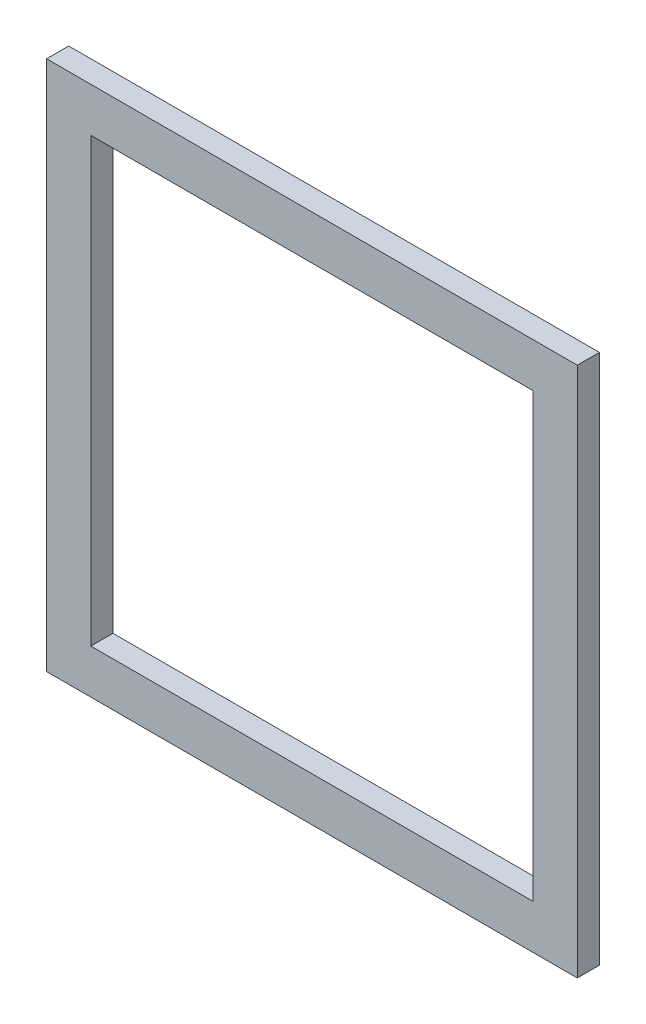
ISO-10303-21;
HEADER;
FILE_DESCRIPTION(('STEP AP214'),'2;1');
FILE_NAME('part.step','',(''),(''),'','','');
FILE_SCHEMA(('AUTOMOTIVE_DESIGN { 1 0 10303 214 1 1 1 1 }'));
ENDSEC;
DATA;
#1=APPLICATION_CONTEXT('core data for automotive mechanical design processes');
#2=APPLICATION_PROTOCOL_DEFINITION('international standard','automotive_design',2000,#1);
#3=PRODUCT_CONTEXT('',#1,'mechanical');
#4=PRODUCT('Part','Part','',(#3));
#5=PRODUCT_RELATED_PRODUCT_CATEGORY('part','',(#4));
#6=PRODUCT_DEFINITION_FORMATION('','',#4);
#7=PRODUCT_DEFINITION_CONTEXT('part definition',#1,'design');
#8=PRODUCT_DEFINITION('design','',#6,#7);
#9=PRODUCT_DEFINITION_SHAPE('','',#8);
#10=(LENGTH_UNIT() NAMED_UNIT(*) SI_UNIT(.MILLI.,.METRE.));
#11=(NAMED_UNIT(*) PLANE_ANGLE_UNIT() SI_UNIT($,.RADIAN.));
#12=(NAMED_UNIT(*) SI_UNIT($,.STERADIAN.) SOLID_ANGLE_UNIT());
#13=UNCERTAINTY_MEASURE_WITH_UNIT(LENGTH_MEASURE(1.E-05),#10,'distance_accuracy_value','');
#14=(GEOMETRIC_REPRESENTATION_CONTEXT(3) GLOBAL_UNCERTAINTY_ASSIGNED_CONTEXT((#13)) GLOBAL_UNIT_ASSIGNED_CONTEXT((#10,
#11,#12)) REPRESENTATION_CONTEXT('',''));
#15=CARTESIAN_POINT('',(0.,0.,0.));
#16=DIRECTION('',(0.,0.,1.));
#17=DIRECTION('',(1.,0.,0.));
#18=AXIS2_PLACEMENT_3D('',#15,#16,#17);
#19=CARTESIAN_POINT('',(0.,0.,3.175));
#20=DIRECTION('',(1.,0.,0.));
#21=DIRECTION('',(0.,0.,-1.));
#22=AXIS2_PLACEMENT_3D('',#19,#20,#21);
#23=PLANE('',#22);
#24=DIRECTION('',(0.,-1.,0.));
#25=VECTOR('',#24,1.);
#26=CARTESIAN_POINT('',(0.,0.,0.));
#27=LINE('',#26,#25);
#28=CARTESIAN_POINT('',(0.,76.2,0.));
#29=VERTEX_POINT('',#28);
#30=CARTESIAN_POINT('',(0.,0.,0.));
#31=VERTEX_POINT('',#30);
#32=EDGE_CURVE('E130',#29,#31,#27,.T.);
#33=ORIENTED_EDGE('',*,*,#32,.T.);
#34=DIRECTION('',(0.,0.,-1.));
#35=VECTOR('',#34,1.);
#36=CARTESIAN_POINT('',(0.,0.,3.175));
#37=LINE('',#36,#35);
#38=CARTESIAN_POINT('',(0.,0.,3.175));
#39=VERTEX_POINT('',#38);
#40=EDGE_CURVE('E11',#39,#31,#37,.T.);
#41=ORIENTED_EDGE('',*,*,#40,.F.);
#42=DIRECTION('',(0.,-1.,0.));
#43=VECTOR('',#42,1.);
#44=CARTESIAN_POINT('',(0.,0.,3.175));
#45=LINE('',#44,#43);
#46=CARTESIAN_POINT('',(0.,76.2,3.175));
#47=VERTEX_POINT('',#46);
#48=EDGE_CURVE('E134',#47,#39,#45,.T.);
#49=ORIENTED_EDGE('',*,*,#48,.F.);
#50=DIRECTION('',(0.,0.,-1.));
#51=VECTOR('',#50,1.);
#52=CARTESIAN_POINT('',(0.,76.2,3.175));
#53=LINE('',#52,#51);
#54=EDGE_CURVE('E144',#47,#29,#53,.T.);
#55=ORIENTED_EDGE('',*,*,#54,.T.);
#56=EDGE_LOOP('',(#33,#41,#49,#55));
#57=FACE_BOUND('',#56,.T.);
#58=ADVANCED_FACE('F33',(#57),#23,.F.);
#59=CARTESIAN_POINT('',(0.,0.,3.175));
#60=DIRECTION('',(0.,1.,0.));
#61=DIRECTION('',(0.,0.,1.));
#62=AXIS2_PLACEMENT_3D('',#59,#60,#61);
#63=PLANE('',#62);
#64=DIRECTION('',(1.,0.,0.));
#65=VECTOR('',#64,1.);
#66=CARTESIAN_POINT('',(0.,0.,0.));
#67=LINE('',#66,#65);
#68=CARTESIAN_POINT('',(76.2,0.,0.));
#69=VERTEX_POINT('',#68);
#70=EDGE_CURVE('E147',#31,#69,#67,.T.);
#71=ORIENTED_EDGE('',*,*,#70,.T.);
#72=DIRECTION('',(0.,0.,-1.));
#73=VECTOR('',#72,1.);
#74=CARTESIAN_POINT('',(76.2,0.,3.175));
#75=LINE('',#74,#73);
#76=CARTESIAN_POINT('',(76.2,0.,3.175));
#77=VERTEX_POINT('',#76);
#78=EDGE_CURVE('E40',#77,#69,#75,.T.);
#79=ORIENTED_EDGE('',*,*,#78,.F.);
#80=DIRECTION('',(1.,0.,0.));
#81=VECTOR('',#80,1.);
#82=CARTESIAN_POINT('',(0.,0.,3.175));
#83=LINE('',#82,#81);
#84=EDGE_CURVE('E137',#39,#77,#83,.T.);
#85=ORIENTED_EDGE('',*,*,#84,.F.);
#86=ORIENTED_EDGE('',*,*,#40,.T.);
#87=EDGE_LOOP('',(#71,#79,#85,#86));
#88=FACE_BOUND('',#87,.T.);
#89=ADVANCED_FACE('F175',(#88),#63,.F.);
#90=CARTESIAN_POINT('',(76.2,0.,3.175));
#91=DIRECTION('',(-1.,0.,0.));
#92=DIRECTION('',(0.,0.,1.));
#93=AXIS2_PLACEMENT_3D('',#90,#91,#92);
#94=PLANE('',#93);
#95=DIRECTION('',(0.,1.,0.));
#96=VECTOR('',#95,1.);
#97=CARTESIAN_POINT('',(76.2,0.,0.));
#98=LINE('',#97,#96);
#99=CARTESIAN_POINT('',(76.2,76.2,0.));
#100=VERTEX_POINT('',#99);
#101=EDGE_CURVE('E149',#69,#100,#98,.T.);
#102=ORIENTED_EDGE('',*,*,#101,.T.);
#103=DIRECTION('',(0.,0.,-1.));
#104=VECTOR('',#103,1.);
#105=CARTESIAN_POINT('',(76.2,76.2,3.175));
#106=LINE('',#105,#104);
#107=CARTESIAN_POINT('',(76.2,76.2,3.175));
#108=VERTEX_POINT('',#107);
#109=EDGE_CURVE('E154',#108,#100,#106,.T.);
#110=ORIENTED_EDGE('',*,*,#109,.F.);
#111=DIRECTION('',(0.,1.,0.));
#112=VECTOR('',#111,1.);
#113=CARTESIAN_POINT('',(76.2,0.,3.175));
#114=LINE('',#113,#112);
#115=EDGE_CURVE('E140',#77,#108,#114,.T.);
#116=ORIENTED_EDGE('',*,*,#115,.F.);
#117=ORIENTED_EDGE('',*,*,#78,.T.);
#118=EDGE_LOOP('',(#102,#110,#116,#117));
#119=FACE_BOUND('',#118,.T.);
#120=ADVANCED_FACE('F161',(#119),#94,.F.);
#121=CARTESIAN_POINT('',(0.,76.2,3.175));
#122=DIRECTION('',(0.,-1.,0.));
#123=DIRECTION('',(0.,0.,-1.));
#124=AXIS2_PLACEMENT_3D('',#121,#122,#123);
#125=PLANE('',#124);
#126=DIRECTION('',(-1.,0.,0.));
#127=VECTOR('',#126,1.);
#128=CARTESIAN_POINT('',(0.,76.2,0.));
#129=LINE('',#128,#127);
#130=EDGE_CURVE('E138',#100,#29,#129,.T.);
#131=ORIENTED_EDGE('',*,*,#130,.T.);
#132=ORIENTED_EDGE('',*,*,#54,.F.);
#133=DIRECTION('',(-1.,0.,0.));
#134=VECTOR('',#133,1.);
#135=CARTESIAN_POINT('',(0.,76.2,3.175));
#136=LINE('',#135,#134);
#137=EDGE_CURVE('E142',#108,#47,#136,.T.);
#138=ORIENTED_EDGE('',*,*,#137,.F.);
#139=ORIENTED_EDGE('',*,*,#109,.T.);
#140=EDGE_LOOP('',(#131,#132,#138,#139));
#141=FACE_BOUND('',#140,.T.);
#142=ADVANCED_FACE('F168',(#141),#125,.F.);
#143=CARTESIAN_POINT('',(0.,0.,3.175));
#144=DIRECTION('',(0.,0.,-1.));
#145=DIRECTION('',(-1.,0.,0.));
#146=AXIS2_PLACEMENT_3D('',#143,#144,#145);
#147=PLANE('',#146);
#148=DIRECTION('',(1.,0.,0.));
#149=VECTOR('',#148,1.);
#150=CARTESIAN_POINT('',(6.35,6.35,3.175));
#151=LINE('',#150,#149);
#152=CARTESIAN_POINT('',(6.35,6.35,3.175));
#153=VERTEX_POINT('',#152);
#154=CARTESIAN_POINT('',(69.85,6.35,3.175));
#155=VERTEX_POINT('',#154);
#156=EDGE_CURVE('E124',#153,#155,#151,.T.);
#157=ORIENTED_EDGE('',*,*,#156,.F.);
#158=DIRECTION('',(0.,-1.,0.));
#159=VECTOR('',#158,1.);
#160=CARTESIAN_POINT('',(6.35,69.85,3.175));
#161=LINE('',#160,#159);
#162=CARTESIAN_POINT('',(6.35,69.85,3.175));
#163=VERTEX_POINT('',#162);
#164=EDGE_CURVE('E47',#163,#153,#161,.T.);
#165=ORIENTED_EDGE('',*,*,#164,.F.);
#166=DIRECTION('',(-1.,0.,0.));
#167=VECTOR('',#166,1.);
#168=CARTESIAN_POINT('',(6.35,69.85,3.175));
#169=LINE('',#168,#167);
#170=CARTESIAN_POINT('',(69.85,69.85,3.175));
#171=VERTEX_POINT('',#170);
#172=EDGE_CURVE('E115',#171,#163,#169,.T.);
#173=ORIENTED_EDGE('',*,*,#172,.F.);
#174=DIRECTION('',(0.,1.,0.));
#175=VECTOR('',#174,1.);
#176=CARTESIAN_POINT('',(69.85,69.85,3.175));
#177=LINE('',#176,#175);
#178=EDGE_CURVE('E118',#155,#171,#177,.T.);
#179=ORIENTED_EDGE('',*,*,#178,.F.);
#180=EDGE_LOOP('',(#157,#165,#173,#179));
#181=FACE_BOUND('',#180,.T.);
#182=ORIENTED_EDGE('',*,*,#48,.T.);
#183=ORIENTED_EDGE('',*,*,#84,.T.);
#184=ORIENTED_EDGE('',*,*,#115,.T.);
#185=ORIENTED_EDGE('',*,*,#137,.T.);
#186=EDGE_LOOP('',(#182,#183,#184,#185));
#187=FACE_BOUND('',#186,.T.);
#188=ADVANCED_FACE('F174',(#181,#187),#147,.F.);
#189=CARTESIAN_POINT('',(0.,0.,0.));
#190=DIRECTION('',(0.,0.,-1.));
#191=DIRECTION('',(-1.,0.,0.));
#192=AXIS2_PLACEMENT_3D('',#189,#190,#191);
#193=PLANE('',#192);
#194=DIRECTION('',(0.,-1.,0.));
#195=VECTOR('',#194,1.);
#196=CARTESIAN_POINT('',(6.35,69.85,0.));
#197=LINE('',#196,#195);
#198=CARTESIAN_POINT('',(6.35,69.85,0.));
#199=VERTEX_POINT('',#198);
#200=CARTESIAN_POINT('',(6.35,6.35,0.));
#201=VERTEX_POINT('',#200);
#202=EDGE_CURVE('E99',#199,#201,#197,.T.);
#203=ORIENTED_EDGE('',*,*,#202,.T.);
#204=DIRECTION('',(1.,0.,0.));
#205=VECTOR('',#204,1.);
#206=CARTESIAN_POINT('',(6.35,6.35,0.));
#207=LINE('',#206,#205);
#208=CARTESIAN_POINT('',(69.85,6.35,0.));
#209=VERTEX_POINT('',#208);
#210=EDGE_CURVE('E108',#201,#209,#207,.T.);
#211=ORIENTED_EDGE('',*,*,#210,.T.);
#212=DIRECTION('',(0.,1.,0.));
#213=VECTOR('',#212,1.);
#214=CARTESIAN_POINT('',(69.85,69.85,0.));
#215=LINE('',#214,#213);
#216=CARTESIAN_POINT('',(69.85,69.85,0.));
#217=VERTEX_POINT('',#216);
#218=EDGE_CURVE('E55',#209,#217,#215,.T.);
#219=ORIENTED_EDGE('',*,*,#218,.T.);
#220=DIRECTION('',(-1.,0.,0.));
#221=VECTOR('',#220,1.);
#222=CARTESIAN_POINT('',(6.35,69.85,0.));
#223=LINE('',#222,#221);
#224=EDGE_CURVE('E105',#217,#199,#223,.T.);
#225=ORIENTED_EDGE('',*,*,#224,.T.);
#226=EDGE_LOOP('',(#203,#211,#219,#225));
#227=FACE_BOUND('',#226,.T.);
#228=ORIENTED_EDGE('',*,*,#32,.F.);
#229=ORIENTED_EDGE('',*,*,#130,.F.);
#230=ORIENTED_EDGE('',*,*,#101,.F.);
#231=ORIENTED_EDGE('',*,*,#70,.F.);
#232=EDGE_LOOP('',(#228,#229,#230,#231));
#233=FACE_BOUND('',#232,.T.);
#234=ADVANCED_FACE('F112',(#227,#233),#193,.T.);
#235=CARTESIAN_POINT('',(6.35,69.85,0.));
#236=DIRECTION('',(-1.,0.,0.));
#237=DIRECTION('',(0.,-1.,0.));
#238=AXIS2_PLACEMENT_3D('',#235,#236,#237);
#239=PLANE('',#238);
#240=ORIENTED_EDGE('',*,*,#164,.T.);
#241=DIRECTION('',(0.,0.,1.));
#242=VECTOR('',#241,1.);
#243=CARTESIAN_POINT('',(6.35,6.35,0.));
#244=LINE('',#243,#242);
#245=EDGE_CURVE('E95',#201,#153,#244,.T.);
#246=ORIENTED_EDGE('',*,*,#245,.F.);
#247=ORIENTED_EDGE('',*,*,#202,.F.);
#248=DIRECTION('',(0.,0.,1.));
#249=VECTOR('',#248,1.);
#250=CARTESIAN_POINT('',(6.35,69.85,0.));
#251=LINE('',#250,#249);
#252=EDGE_CURVE('E128',#199,#163,#251,.T.);
#253=ORIENTED_EDGE('',*,*,#252,.T.);
#254=EDGE_LOOP('',(#240,#246,#247,#253));
#255=FACE_BOUND('',#254,.T.);
#256=ADVANCED_FACE('F97',(#255),#239,.F.);
#257=CARTESIAN_POINT('',(6.35,69.85,0.));
#258=DIRECTION('',(0.,1.,0.));
#259=DIRECTION('',(0.,0.,1.));
#260=AXIS2_PLACEMENT_3D('',#257,#258,#259);
#261=PLANE('',#260);
#262=ORIENTED_EDGE('',*,*,#172,.T.);
#263=ORIENTED_EDGE('',*,*,#252,.F.);
#264=ORIENTED_EDGE('',*,*,#224,.F.);
#265=DIRECTION('',(0.,0.,1.));
#266=VECTOR('',#265,1.);
#267=CARTESIAN_POINT('',(69.85,69.85,0.));
#268=LINE('',#267,#266);
#269=EDGE_CURVE('E131',#217,#171,#268,.T.);
#270=ORIENTED_EDGE('',*,*,#269,.T.);
#271=EDGE_LOOP('',(#262,#263,#264,#270));
#272=FACE_BOUND('',#271,.T.);
#273=ADVANCED_FACE('F192',(#272),#261,.F.);
#274=CARTESIAN_POINT('',(69.85,69.85,0.));
#275=DIRECTION('',(1.,0.,0.));
#276=DIRECTION('',(0.,0.,-1.));
#277=AXIS2_PLACEMENT_3D('',#274,#275,#276);
#278=PLANE('',#277);
#279=ORIENTED_EDGE('',*,*,#178,.T.);
#280=ORIENTED_EDGE('',*,*,#269,.F.);
#281=ORIENTED_EDGE('',*,*,#218,.F.);
#282=DIRECTION('',(0.,0.,1.));
#283=VECTOR('',#282,1.);
#284=CARTESIAN_POINT('',(69.85,6.35,0.));
#285=LINE('',#284,#283);
#286=EDGE_CURVE('E104',#209,#155,#285,.T.);
#287=ORIENTED_EDGE('',*,*,#286,.T.);
#288=EDGE_LOOP('',(#279,#280,#281,#287));
#289=FACE_BOUND('',#288,.T.);
#290=ADVANCED_FACE('F195',(#289),#278,.F.);
#291=CARTESIAN_POINT('',(6.35,6.35,0.));
#292=DIRECTION('',(0.,-1.,0.));
#293=DIRECTION('',(1.,0.,0.));
#294=AXIS2_PLACEMENT_3D('',#291,#292,#293);
#295=PLANE('',#294);
#296=ORIENTED_EDGE('',*,*,#156,.T.);
#297=ORIENTED_EDGE('',*,*,#286,.F.);
#298=ORIENTED_EDGE('',*,*,#210,.F.);
#299=ORIENTED_EDGE('',*,*,#245,.T.);
#300=EDGE_LOOP('',(#296,#297,#298,#299));
#301=FACE_BOUND('',#300,.T.);
#302=ADVANCED_FACE('F109',(#301),#295,.F.);
#303=CLOSED_SHELL('',(#58,#89,#120,#142,#188,#234,#256,#273,#290,#302));
#304=MANIFOLD_SOLID_BREP('B2',#303);
#305=ADVANCED_BREP_SHAPE_REPRESENTATION('',(#18,#304),#14);
#306=SHAPE_DEFINITION_REPRESENTATION(#9,#305);
ENDSEC;
END-ISO-10303-21;
